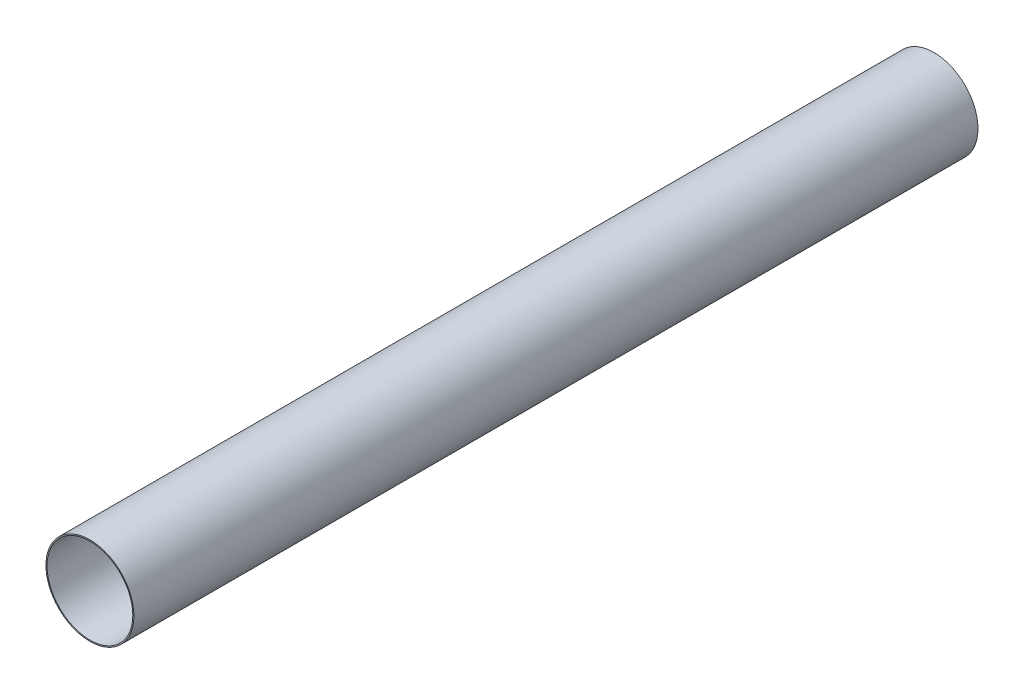
ISO-10303-21;
HEADER;
FILE_DESCRIPTION(('STEP AP214'),'2;1');
FILE_NAME('part.step','',(''),(''),'','','');
FILE_SCHEMA(('AUTOMOTIVE_DESIGN { 1 0 10303 214 1 1 1 1 }'));
ENDSEC;
DATA;
#1=APPLICATION_CONTEXT('core data for automotive mechanical design processes');
#2=APPLICATION_PROTOCOL_DEFINITION('international standard','automotive_design',2000,#1);
#3=PRODUCT_CONTEXT('',#1,'mechanical');
#4=PRODUCT('Part','Part','',(#3));
#5=PRODUCT_RELATED_PRODUCT_CATEGORY('part','',(#4));
#6=PRODUCT_DEFINITION_FORMATION('','',#4);
#7=PRODUCT_DEFINITION_CONTEXT('part definition',#1,'design');
#8=PRODUCT_DEFINITION('design','',#6,#7);
#9=PRODUCT_DEFINITION_SHAPE('','',#8);
#10=(LENGTH_UNIT() NAMED_UNIT(*) SI_UNIT(.MILLI.,.METRE.));
#11=(NAMED_UNIT(*) PLANE_ANGLE_UNIT() SI_UNIT($,.RADIAN.));
#12=(NAMED_UNIT(*) SI_UNIT($,.STERADIAN.) SOLID_ANGLE_UNIT());
#13=UNCERTAINTY_MEASURE_WITH_UNIT(LENGTH_MEASURE(1.E-05),#10,'distance_accuracy_value','');
#14=(GEOMETRIC_REPRESENTATION_CONTEXT(3) GLOBAL_UNCERTAINTY_ASSIGNED_CONTEXT((#13)) GLOBAL_UNIT_ASSIGNED_CONTEXT((#10,
#11,#12)) REPRESENTATION_CONTEXT('',''));
#15=CARTESIAN_POINT('',(0.,0.,0.));
#16=DIRECTION('',(0.,0.,1.));
#17=DIRECTION('',(1.,0.,0.));
#18=AXIS2_PLACEMENT_3D('',#15,#16,#17);
#19=CARTESIAN_POINT('',(0.,0.,1500.));
#20=DIRECTION('',(0.,0.,1.));
#21=DIRECTION('',(1.,0.,0.));
#22=AXIS2_PLACEMENT_3D('',#19,#20,#21);
#23=PLANE('',#22);
#24=CARTESIAN_POINT('',(0.,0.,1500.));
#25=DIRECTION('',(0.,0.,1.));
#26=DIRECTION('',(1.,0.,0.));
#27=AXIS2_PLACEMENT_3D('',#24,#25,#26);
#28=CIRCLE('',#27,78.2);
#29=CARTESIAN_POINT('',(78.2,0.,1500.));
#30=VERTEX_POINT('',#29);
#31=EDGE_CURVE('E10',#30,#30,#28,.T.);
#32=ORIENTED_EDGE('',*,*,#31,.T.);
#33=EDGE_LOOP('',(#32));
#34=FACE_BOUND('',#33,.T.);
#35=CARTESIAN_POINT('',(0.,0.,1500.));
#36=DIRECTION('',(0.,0.,1.));
#37=DIRECTION('',(1.,0.,0.));
#38=AXIS2_PLACEMENT_3D('',#35,#36,#37);
#39=CIRCLE('',#38,76.2);
#40=CARTESIAN_POINT('',(76.2,0.,1500.));
#41=VERTEX_POINT('',#40);
#42=EDGE_CURVE('E50',#41,#41,#39,.T.);
#43=ORIENTED_EDGE('',*,*,#42,.F.);
#44=EDGE_LOOP('',(#43));
#45=FACE_BOUND('',#44,.T.);
#46=ADVANCED_FACE('F37',(#34,#45),#23,.T.);
#47=CARTESIAN_POINT('',(0.,0.,0.));
#48=DIRECTION('',(0.,0.,1.));
#49=DIRECTION('',(1.,0.,0.));
#50=AXIS2_PLACEMENT_3D('',#47,#48,#49);
#51=PLANE('',#50);
#52=CARTESIAN_POINT('',(0.,0.,0.));
#53=DIRECTION('',(0.,0.,1.));
#54=DIRECTION('',(1.,0.,0.));
#55=AXIS2_PLACEMENT_3D('',#52,#53,#54);
#56=CIRCLE('',#55,78.2);
#57=CARTESIAN_POINT('',(78.2,0.,0.));
#58=VERTEX_POINT('',#57);
#59=EDGE_CURVE('E41',#58,#58,#56,.T.);
#60=ORIENTED_EDGE('',*,*,#59,.F.);
#61=EDGE_LOOP('',(#60));
#62=FACE_BOUND('',#61,.T.);
#63=CARTESIAN_POINT('',(0.,0.,0.));
#64=DIRECTION('',(0.,0.,1.));
#65=DIRECTION('',(1.,0.,0.));
#66=AXIS2_PLACEMENT_3D('',#63,#64,#65);
#67=CIRCLE('',#66,76.2);
#68=CARTESIAN_POINT('',(76.2,0.,0.));
#69=VERTEX_POINT('',#68);
#70=EDGE_CURVE('E52',#69,#69,#67,.T.);
#71=ORIENTED_EDGE('',*,*,#70,.T.);
#72=EDGE_LOOP('',(#71));
#73=FACE_BOUND('',#72,.T.);
#74=ADVANCED_FACE('F64',(#62,#73),#51,.F.);
#75=CARTESIAN_POINT('',(0.,0.,1500.));
#76=DIRECTION('',(0.,0.,-1.));
#77=DIRECTION('',(-1.,0.,0.));
#78=AXIS2_PLACEMENT_3D('',#75,#76,#77);
#79=CYLINDRICAL_SURFACE('',#78,78.2);
#80=ORIENTED_EDGE('',*,*,#31,.F.);
#81=EDGE_LOOP('',(#80));
#82=FACE_BOUND('',#81,.T.);
#83=ORIENTED_EDGE('',*,*,#59,.T.);
#84=EDGE_LOOP('',(#83));
#85=FACE_BOUND('',#84,.T.);
#86=ADVANCED_FACE('F39',(#82,#85),#79,.T.);
#87=CARTESIAN_POINT('',(0.,0.,1500.));
#88=DIRECTION('',(0.,0.,-1.));
#89=DIRECTION('',(-1.,0.,0.));
#90=AXIS2_PLACEMENT_3D('',#87,#88,#89);
#91=CYLINDRICAL_SURFACE('',#90,76.2);
#92=ORIENTED_EDGE('',*,*,#42,.T.);
#93=EDGE_LOOP('',(#92));
#94=FACE_BOUND('',#93,.T.);
#95=ORIENTED_EDGE('',*,*,#70,.F.);
#96=EDGE_LOOP('',(#95));
#97=FACE_BOUND('',#96,.T.);
#98=ADVANCED_FACE('F60',(#94,#97),#91,.F.);
#99=CLOSED_SHELL('',(#46,#74,#86,#98));
#100=MANIFOLD_SOLID_BREP('B2',#99);
#101=ADVANCED_BREP_SHAPE_REPRESENTATION('',(#18,#100),#14);
#102=SHAPE_DEFINITION_REPRESENTATION(#9,#101);
ENDSEC;
END-ISO-10303-21;
